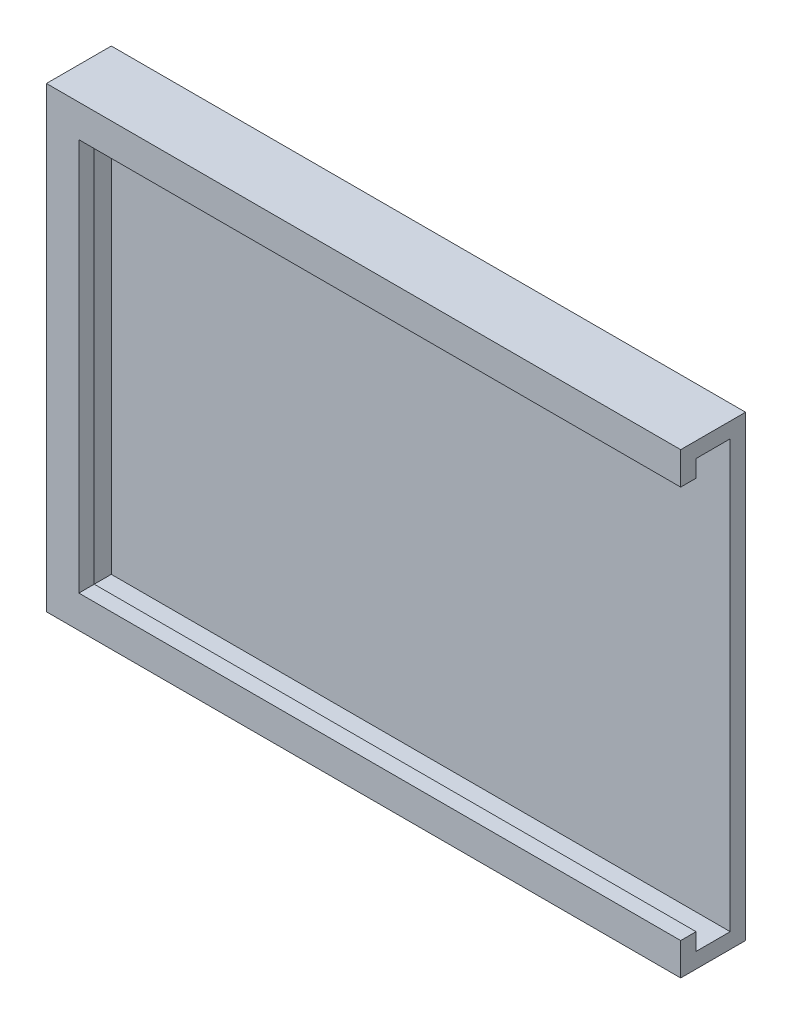
ISO-10303-21;
HEADER;
FILE_DESCRIPTION(('STEP AP214'),'2;1');
FILE_NAME('part.step','',(''),(''),'','','');
FILE_SCHEMA(('AUTOMOTIVE_DESIGN { 1 0 10303 214 1 1 1 1 }'));
ENDSEC;
DATA;
#1=APPLICATION_CONTEXT('core data for automotive mechanical design processes');
#2=APPLICATION_PROTOCOL_DEFINITION('international standard','automotive_design',2000,#1);
#3=PRODUCT_CONTEXT('',#1,'mechanical');
#4=PRODUCT('Part','Part','',(#3));
#5=PRODUCT_RELATED_PRODUCT_CATEGORY('part','',(#4));
#6=PRODUCT_DEFINITION_FORMATION('','',#4);
#7=PRODUCT_DEFINITION_CONTEXT('part definition',#1,'design');
#8=PRODUCT_DEFINITION('design','',#6,#7);
#9=PRODUCT_DEFINITION_SHAPE('','',#8);
#10=(LENGTH_UNIT() NAMED_UNIT(*) SI_UNIT(.MILLI.,.METRE.));
#11=(NAMED_UNIT(*) PLANE_ANGLE_UNIT() SI_UNIT($,.RADIAN.));
#12=(NAMED_UNIT(*) SI_UNIT($,.STERADIAN.) SOLID_ANGLE_UNIT());
#13=UNCERTAINTY_MEASURE_WITH_UNIT(LENGTH_MEASURE(1.E-05),#10,'distance_accuracy_value','');
#14=(GEOMETRIC_REPRESENTATION_CONTEXT(3) GLOBAL_UNCERTAINTY_ASSIGNED_CONTEXT((#13)) GLOBAL_UNIT_ASSIGNED_CONTEXT((#10,
#11,#12)) REPRESENTATION_CONTEXT('',''));
#15=CARTESIAN_POINT('',(0.,0.,0.));
#16=DIRECTION('',(0.,0.,1.));
#17=DIRECTION('',(1.,0.,0.));
#18=AXIS2_PLACEMENT_3D('',#15,#16,#17);
#19=CARTESIAN_POINT('',(36.25,25.,4.));
#20=DIRECTION('',(-1.,0.,0.));
#21=DIRECTION('',(0.,-1.,0.));
#22=AXIS2_PLACEMENT_3D('',#19,#20,#21);
#23=PLANE('',#22);
#24=DIRECTION('',(0.,0.,-1.));
#25=VECTOR('',#24,1.);
#26=CARTESIAN_POINT('',(36.25,23.,5.800012));
#27=LINE('',#26,#25);
#28=CARTESIAN_POINT('',(36.25,23.,5.8));
#29=VERTEX_POINT('',#28);
#30=CARTESIAN_POINT('',(36.25,23.,4.));
#31=VERTEX_POINT('',#30);
#32=EDGE_CURVE('E159',#29,#31,#27,.T.);
#33=ORIENTED_EDGE('',*,*,#32,.T.);
#34=DIRECTION('',(0.,1.,0.));
#35=VECTOR('',#34,1.);
#36=CARTESIAN_POINT('',(36.25,25.,4.));
#37=LINE('',#36,#35);
#38=CARTESIAN_POINT('',(36.25,25.,4.));
#39=VERTEX_POINT('',#38);
#40=EDGE_CURVE('E172',#31,#39,#37,.T.);
#41=ORIENTED_EDGE('',*,*,#40,.T.);
#42=DIRECTION('',(0.,0.,-1.));
#43=VECTOR('',#42,1.);
#44=CARTESIAN_POINT('',(36.25,25.,4.));
#45=LINE('',#44,#43);
#46=CARTESIAN_POINT('',(36.25,25.,0.));
#47=VERTEX_POINT('',#46);
#48=EDGE_CURVE('E205',#39,#47,#45,.T.);
#49=ORIENTED_EDGE('',*,*,#48,.T.);
#50=DIRECTION('',(0.,1.,0.));
#51=VECTOR('',#50,1.);
#52=CARTESIAN_POINT('',(36.25,25.,0.));
#53=LINE('',#52,#51);
#54=CARTESIAN_POINT('',(36.25,-25.,0.));
#55=VERTEX_POINT('',#54);
#56=EDGE_CURVE('E168',#55,#47,#53,.T.);
#57=ORIENTED_EDGE('',*,*,#56,.F.);
#58=DIRECTION('',(0.,0.,-1.));
#59=VECTOR('',#58,1.);
#60=CARTESIAN_POINT('',(36.25,-25.,4.));
#61=LINE('',#60,#59);
#62=CARTESIAN_POINT('',(36.25,-25.,4.));
#63=VERTEX_POINT('',#62);
#64=EDGE_CURVE('E181',#63,#55,#61,.T.);
#65=ORIENTED_EDGE('',*,*,#64,.F.);
#66=CARTESIAN_POINT('',(36.25,-23.,4.));
#67=VERTEX_POINT('',#66);
#68=EDGE_CURVE('E68',#63,#67,#37,.T.);
#69=ORIENTED_EDGE('',*,*,#68,.T.);
#70=DIRECTION('',(0.,0.,-1.));
#71=VECTOR('',#70,1.);
#72=CARTESIAN_POINT('',(36.25,-23.,5.800012));
#73=LINE('',#72,#71);
#74=CARTESIAN_POINT('',(36.25,-23.,5.8));
#75=VERTEX_POINT('',#74);
#76=EDGE_CURVE('E61',#75,#67,#73,.T.);
#77=ORIENTED_EDGE('',*,*,#76,.F.);
#78=DIRECTION('',(0.,1.,0.));
#79=VECTOR('',#78,1.);
#80=CARTESIAN_POINT('',(36.25,25.,5.8));
#81=LINE('',#80,#79);
#82=CARTESIAN_POINT('',(36.25,-26.8,5.8));
#83=VERTEX_POINT('',#82);
#84=EDGE_CURVE('E157',#83,#75,#81,.T.);
#85=ORIENTED_EDGE('',*,*,#84,.F.);
#86=DIRECTION('',(0.,0.,-1.));
#87=VECTOR('',#86,1.);
#88=CARTESIAN_POINT('',(36.25,-26.8,4.));
#89=LINE('',#88,#87);
#90=CARTESIAN_POINT('',(36.25,-26.8,-1.8));
#91=VERTEX_POINT('',#90);
#92=EDGE_CURVE('E230',#83,#91,#89,.T.);
#93=ORIENTED_EDGE('',*,*,#92,.T.);
#94=DIRECTION('',(0.,1.,0.));
#95=VECTOR('',#94,1.);
#96=CARTESIAN_POINT('',(36.25,25.,-1.8));
#97=LINE('',#96,#95);
#98=CARTESIAN_POINT('',(36.25,26.8,-1.8));
#99=VERTEX_POINT('',#98);
#100=EDGE_CURVE('E209',#91,#99,#97,.T.);
#101=ORIENTED_EDGE('',*,*,#100,.T.);
#102=DIRECTION('',(0.,0.,-1.));
#103=VECTOR('',#102,1.);
#104=CARTESIAN_POINT('',(36.25,26.8,4.));
#105=LINE('',#104,#103);
#106=CARTESIAN_POINT('',(36.25,26.8,5.8));
#107=VERTEX_POINT('',#106);
#108=EDGE_CURVE('E218',#107,#99,#105,.T.);
#109=ORIENTED_EDGE('',*,*,#108,.F.);
#110=EDGE_CURVE('E236',#29,#107,#81,.T.);
#111=ORIENTED_EDGE('',*,*,#110,.F.);
#112=EDGE_LOOP('',(#33,#41,#49,#57,#65,#69,#77,#85,#93,#101,#109,#111));
#113=FACE_BOUND('',#112,.T.);
#114=ADVANCED_FACE('F45',(#113),#23,.F.);
#115=CARTESIAN_POINT('',(0.,0.,5.8));
#116=DIRECTION('',(0.,0.,1.));
#117=DIRECTION('',(1.,0.,0.));
#118=AXIS2_PLACEMENT_3D('',#115,#116,#117);
#119=PLANE('',#118);
#120=DIRECTION('',(0.,1.,0.));
#121=VECTOR('',#120,1.);
#122=CARTESIAN_POINT('',(-34.25,0.,5.8));
#123=LINE('',#122,#121);
#124=CARTESIAN_POINT('',(-34.25,-23.,5.8));
#125=VERTEX_POINT('',#124);
#126=CARTESIAN_POINT('',(-34.25,23.,5.8));
#127=VERTEX_POINT('',#126);
#128=EDGE_CURVE('E136',#125,#127,#123,.T.);
#129=ORIENTED_EDGE('',*,*,#128,.T.);
#130=DIRECTION('',(1.,0.,0.));
#131=VECTOR('',#130,1.);
#132=CARTESIAN_POINT('',(0.,23.,5.8));
#133=LINE('',#132,#131);
#134=EDGE_CURVE('E147',#127,#29,#133,.T.);
#135=ORIENTED_EDGE('',*,*,#134,.T.);
#136=ORIENTED_EDGE('',*,*,#110,.T.);
#137=DIRECTION('',(-1.,0.,0.));
#138=VECTOR('',#137,1.);
#139=CARTESIAN_POINT('',(-36.25,26.8,5.8));
#140=LINE('',#139,#138);
#141=CARTESIAN_POINT('',(-38.05,26.8,5.8));
#142=VERTEX_POINT('',#141);
#143=EDGE_CURVE('E220',#107,#142,#140,.T.);
#144=ORIENTED_EDGE('',*,*,#143,.T.);
#145=DIRECTION('',(0.,-1.,0.));
#146=VECTOR('',#145,1.);
#147=CARTESIAN_POINT('',(-38.05,25.,5.8));
#148=LINE('',#147,#146);
#149=CARTESIAN_POINT('',(-38.05,-26.8,5.8));
#150=VERTEX_POINT('',#149);
#151=EDGE_CURVE('E223',#142,#150,#148,.T.);
#152=ORIENTED_EDGE('',*,*,#151,.T.);
#153=DIRECTION('',(1.,0.,0.));
#154=VECTOR('',#153,1.);
#155=CARTESIAN_POINT('',(-36.25,-26.8,5.8));
#156=LINE('',#155,#154);
#157=EDGE_CURVE('E233',#150,#83,#156,.T.);
#158=ORIENTED_EDGE('',*,*,#157,.T.);
#159=ORIENTED_EDGE('',*,*,#84,.T.);
#160=DIRECTION('',(-1.,0.,0.));
#161=VECTOR('',#160,1.);
#162=CARTESIAN_POINT('',(0.,-23.,5.8));
#163=LINE('',#162,#161);
#164=EDGE_CURVE('E148',#75,#125,#163,.T.);
#165=ORIENTED_EDGE('',*,*,#164,.T.);
#166=EDGE_LOOP('',(#129,#135,#136,#144,#152,#158,#159,#165));
#167=FACE_BOUND('',#166,.T.);
#168=ADVANCED_FACE('F155',(#167),#119,.T.);
#169=CARTESIAN_POINT('',(0.,0.,4.));
#170=DIRECTION('',(0.,0.,1.));
#171=DIRECTION('',(1.,0.,0.));
#172=AXIS2_PLACEMENT_3D('',#169,#170,#171);
#173=PLANE('',#172);
#174=DIRECTION('',(1.,0.,0.));
#175=VECTOR('',#174,1.);
#176=CARTESIAN_POINT('',(0.,23.,4.));
#177=LINE('',#176,#175);
#178=CARTESIAN_POINT('',(-34.25,23.,4.));
#179=VERTEX_POINT('',#178);
#180=EDGE_CURVE('E11',#179,#31,#177,.T.);
#181=ORIENTED_EDGE('',*,*,#180,.F.);
#182=DIRECTION('',(0.,1.,0.));
#183=VECTOR('',#182,1.);
#184=CARTESIAN_POINT('',(-34.25,0.,4.));
#185=LINE('',#184,#183);
#186=CARTESIAN_POINT('',(-34.25,-23.,4.));
#187=VERTEX_POINT('',#186);
#188=EDGE_CURVE('E54',#187,#179,#185,.T.);
#189=ORIENTED_EDGE('',*,*,#188,.F.);
#190=DIRECTION('',(-1.,0.,0.));
#191=VECTOR('',#190,1.);
#192=CARTESIAN_POINT('',(0.,-23.,4.));
#193=LINE('',#192,#191);
#194=EDGE_CURVE('E151',#67,#187,#193,.T.);
#195=ORIENTED_EDGE('',*,*,#194,.F.);
#196=ORIENTED_EDGE('',*,*,#68,.F.);
#197=DIRECTION('',(1.,0.,0.));
#198=VECTOR('',#197,1.);
#199=CARTESIAN_POINT('',(-36.25,-25.,4.));
#200=LINE('',#199,#198);
#201=CARTESIAN_POINT('',(-36.25,-25.,4.));
#202=VERTEX_POINT('',#201);
#203=EDGE_CURVE('E178',#202,#63,#200,.T.);
#204=ORIENTED_EDGE('',*,*,#203,.F.);
#205=DIRECTION('',(0.,-1.,0.));
#206=VECTOR('',#205,1.);
#207=CARTESIAN_POINT('',(-36.25,25.,4.));
#208=LINE('',#207,#206);
#209=CARTESIAN_POINT('',(-36.25,25.,4.));
#210=VERTEX_POINT('',#209);
#211=EDGE_CURVE('E175',#210,#202,#208,.T.);
#212=ORIENTED_EDGE('',*,*,#211,.F.);
#213=DIRECTION('',(-1.,0.,0.));
#214=VECTOR('',#213,1.);
#215=CARTESIAN_POINT('',(-36.25,25.,4.));
#216=LINE('',#215,#214);
#217=EDGE_CURVE('E171',#39,#210,#216,.T.);
#218=ORIENTED_EDGE('',*,*,#217,.F.);
#219=ORIENTED_EDGE('',*,*,#40,.F.);
#220=EDGE_LOOP('',(#181,#189,#195,#196,#204,#212,#218,#219));
#221=FACE_BOUND('',#220,.T.);
#222=ADVANCED_FACE('F257',(#221),#173,.F.);
#223=CARTESIAN_POINT('',(-36.25,26.8,4.));
#224=DIRECTION('',(0.,-1.,0.));
#225=DIRECTION('',(0.,0.,-1.));
#226=AXIS2_PLACEMENT_3D('',#223,#224,#225);
#227=PLANE('',#226);
#228=DIRECTION('',(-1.,0.,0.));
#229=VECTOR('',#228,1.);
#230=CARTESIAN_POINT('',(-36.25,26.8,-1.8));
#231=LINE('',#230,#229);
#232=CARTESIAN_POINT('',(-38.05,26.8,-1.8));
#233=VERTEX_POINT('',#232);
#234=EDGE_CURVE('E210',#99,#233,#231,.T.);
#235=ORIENTED_EDGE('',*,*,#234,.T.);
#236=DIRECTION('',(0.,0.,-1.));
#237=VECTOR('',#236,1.);
#238=CARTESIAN_POINT('',(-38.05,26.8,4.));
#239=LINE('',#238,#237);
#240=EDGE_CURVE('E214',#142,#233,#239,.T.);
#241=ORIENTED_EDGE('',*,*,#240,.F.);
#242=ORIENTED_EDGE('',*,*,#143,.F.);
#243=ORIENTED_EDGE('',*,*,#108,.T.);
#244=EDGE_LOOP('',(#235,#241,#242,#243));
#245=FACE_BOUND('',#244,.T.);
#246=ADVANCED_FACE('F269',(#245),#227,.F.);
#247=CARTESIAN_POINT('',(-38.05,25.,4.));
#248=DIRECTION('',(1.,0.,0.));
#249=DIRECTION('',(0.,1.,0.));
#250=AXIS2_PLACEMENT_3D('',#247,#248,#249);
#251=PLANE('',#250);
#252=DIRECTION('',(0.,-1.,0.));
#253=VECTOR('',#252,1.);
#254=CARTESIAN_POINT('',(-38.05,25.,-1.8));
#255=LINE('',#254,#253);
#256=CARTESIAN_POINT('',(-38.05,-26.8,-1.8));
#257=VERTEX_POINT('',#256);
#258=EDGE_CURVE('E213',#233,#257,#255,.T.);
#259=ORIENTED_EDGE('',*,*,#258,.T.);
#260=DIRECTION('',(0.,0.,-1.));
#261=VECTOR('',#260,1.);
#262=CARTESIAN_POINT('',(-38.05,-26.8,4.));
#263=LINE('',#262,#261);
#264=EDGE_CURVE('E219',#150,#257,#263,.T.);
#265=ORIENTED_EDGE('',*,*,#264,.F.);
#266=ORIENTED_EDGE('',*,*,#151,.F.);
#267=ORIENTED_EDGE('',*,*,#240,.T.);
#268=EDGE_LOOP('',(#259,#265,#266,#267));
#269=FACE_BOUND('',#268,.T.);
#270=ADVANCED_FACE('F277',(#269),#251,.F.);
#271=CARTESIAN_POINT('',(-36.25,-26.8,4.));
#272=DIRECTION('',(0.,1.,0.));
#273=DIRECTION('',(0.,0.,1.));
#274=AXIS2_PLACEMENT_3D('',#271,#272,#273);
#275=PLANE('',#274);
#276=DIRECTION('',(1.,0.,0.));
#277=VECTOR('',#276,1.);
#278=CARTESIAN_POINT('',(-36.25,-26.8,-1.8));
#279=LINE('',#278,#277);
#280=EDGE_CURVE('E226',#257,#91,#279,.T.);
#281=ORIENTED_EDGE('',*,*,#280,.T.);
#282=ORIENTED_EDGE('',*,*,#92,.F.);
#283=ORIENTED_EDGE('',*,*,#157,.F.);
#284=ORIENTED_EDGE('',*,*,#264,.T.);
#285=EDGE_LOOP('',(#281,#282,#283,#284));
#286=FACE_BOUND('',#285,.T.);
#287=ADVANCED_FACE('F281',(#286),#275,.F.);
#288=CARTESIAN_POINT('',(0.,0.,-1.8));
#289=DIRECTION('',(0.,0.,1.));
#290=DIRECTION('',(1.,0.,0.));
#291=AXIS2_PLACEMENT_3D('',#288,#289,#290);
#292=PLANE('',#291);
#293=ORIENTED_EDGE('',*,*,#100,.F.);
#294=ORIENTED_EDGE('',*,*,#280,.F.);
#295=ORIENTED_EDGE('',*,*,#258,.F.);
#296=ORIENTED_EDGE('',*,*,#234,.F.);
#297=EDGE_LOOP('',(#293,#294,#295,#296));
#298=FACE_BOUND('',#297,.T.);
#299=ADVANCED_FACE('F47',(#298),#292,.F.);
#300=CARTESIAN_POINT('',(-36.25,25.,4.));
#301=DIRECTION('',(0.,-1.,0.));
#302=DIRECTION('',(0.,0.,-1.));
#303=AXIS2_PLACEMENT_3D('',#300,#301,#302);
#304=PLANE('',#303);
#305=DIRECTION('',(-1.,0.,0.));
#306=VECTOR('',#305,1.);
#307=CARTESIAN_POINT('',(-36.25,25.,0.));
#308=LINE('',#307,#306);
#309=CARTESIAN_POINT('',(-36.25,25.,0.));
#310=VERTEX_POINT('',#309);
#311=EDGE_CURVE('E185',#47,#310,#308,.T.);
#312=ORIENTED_EDGE('',*,*,#311,.F.);
#313=ORIENTED_EDGE('',*,*,#48,.F.);
#314=ORIENTED_EDGE('',*,*,#217,.T.);
#315=DIRECTION('',(0.,0.,-1.));
#316=VECTOR('',#315,1.);
#317=CARTESIAN_POINT('',(-36.25,25.,4.));
#318=LINE('',#317,#316);
#319=EDGE_CURVE('E201',#210,#310,#318,.T.);
#320=ORIENTED_EDGE('',*,*,#319,.T.);
#321=EDGE_LOOP('',(#312,#313,#314,#320));
#322=FACE_BOUND('',#321,.T.);
#323=ADVANCED_FACE('F295',(#322),#304,.T.);
#324=CARTESIAN_POINT('',(-36.25,25.,4.));
#325=DIRECTION('',(1.,0.,0.));
#326=DIRECTION('',(0.,1.,0.));
#327=AXIS2_PLACEMENT_3D('',#324,#325,#326);
#328=PLANE('',#327);
#329=DIRECTION('',(0.,-1.,0.));
#330=VECTOR('',#329,1.);
#331=CARTESIAN_POINT('',(-36.25,25.,0.));
#332=LINE('',#331,#330);
#333=CARTESIAN_POINT('',(-36.25,-25.,0.));
#334=VERTEX_POINT('',#333);
#335=EDGE_CURVE('E188',#310,#334,#332,.T.);
#336=ORIENTED_EDGE('',*,*,#335,.F.);
#337=ORIENTED_EDGE('',*,*,#319,.F.);
#338=ORIENTED_EDGE('',*,*,#211,.T.);
#339=DIRECTION('',(0.,0.,-1.));
#340=VECTOR('',#339,1.);
#341=CARTESIAN_POINT('',(-36.25,-25.,4.));
#342=LINE('',#341,#340);
#343=EDGE_CURVE('E197',#202,#334,#342,.T.);
#344=ORIENTED_EDGE('',*,*,#343,.T.);
#345=EDGE_LOOP('',(#336,#337,#338,#344));
#346=FACE_BOUND('',#345,.T.);
#347=ADVANCED_FACE('F293',(#346),#328,.T.);
#348=CARTESIAN_POINT('',(-36.25,-25.,4.));
#349=DIRECTION('',(0.,1.,0.));
#350=DIRECTION('',(0.,0.,1.));
#351=AXIS2_PLACEMENT_3D('',#348,#349,#350);
#352=PLANE('',#351);
#353=DIRECTION('',(1.,0.,0.));
#354=VECTOR('',#353,1.);
#355=CARTESIAN_POINT('',(-36.25,-25.,0.));
#356=LINE('',#355,#354);
#357=EDGE_CURVE('E191',#334,#55,#356,.T.);
#358=ORIENTED_EDGE('',*,*,#357,.F.);
#359=ORIENTED_EDGE('',*,*,#343,.F.);
#360=ORIENTED_EDGE('',*,*,#203,.T.);
#361=ORIENTED_EDGE('',*,*,#64,.T.);
#362=EDGE_LOOP('',(#358,#359,#360,#361));
#363=FACE_BOUND('',#362,.T.);
#364=ADVANCED_FACE('F288',(#363),#352,.T.);
#365=CARTESIAN_POINT('',(0.,0.,0.));
#366=DIRECTION('',(0.,0.,1.));
#367=DIRECTION('',(1.,0.,0.));
#368=AXIS2_PLACEMENT_3D('',#365,#366,#367);
#369=PLANE('',#368);
#370=ORIENTED_EDGE('',*,*,#56,.T.);
#371=ORIENTED_EDGE('',*,*,#311,.T.);
#372=ORIENTED_EDGE('',*,*,#335,.T.);
#373=ORIENTED_EDGE('',*,*,#357,.T.);
#374=EDGE_LOOP('',(#370,#371,#372,#373));
#375=FACE_BOUND('',#374,.T.);
#376=ADVANCED_FACE('F297',(#375),#369,.T.);
#377=CARTESIAN_POINT('',(34.25,23.,5.800012));
#378=DIRECTION('',(0.,-1.,0.));
#379=DIRECTION('',(0.,0.,-1.));
#380=AXIS2_PLACEMENT_3D('',#377,#378,#379);
#381=PLANE('',#380);
#382=DIRECTION('',(0.,0.,-1.));
#383=VECTOR('',#382,1.);
#384=CARTESIAN_POINT('',(-34.25,23.,5.800012));
#385=LINE('',#384,#383);
#386=EDGE_CURVE('E142',#127,#179,#385,.T.);
#387=ORIENTED_EDGE('',*,*,#386,.T.);
#388=ORIENTED_EDGE('',*,*,#180,.T.);
#389=ORIENTED_EDGE('',*,*,#32,.F.);
#390=ORIENTED_EDGE('',*,*,#134,.F.);
#391=EDGE_LOOP('',(#387,#388,#389,#390));
#392=FACE_BOUND('',#391,.T.);
#393=ADVANCED_FACE('F254',(#392),#381,.T.);
#394=CARTESIAN_POINT('',(-34.25,23.,5.800012));
#395=DIRECTION('',(1.,0.,0.));
#396=DIRECTION('',(0.,1.,0.));
#397=AXIS2_PLACEMENT_3D('',#394,#395,#396);
#398=PLANE('',#397);
#399=DIRECTION('',(0.,0.,-1.));
#400=VECTOR('',#399,1.);
#401=CARTESIAN_POINT('',(-34.25,-23.,5.800012));
#402=LINE('',#401,#400);
#403=EDGE_CURVE('E139',#125,#187,#402,.T.);
#404=ORIENTED_EDGE('',*,*,#403,.T.);
#405=ORIENTED_EDGE('',*,*,#188,.T.);
#406=ORIENTED_EDGE('',*,*,#386,.F.);
#407=ORIENTED_EDGE('',*,*,#128,.F.);
#408=EDGE_LOOP('',(#404,#405,#406,#407));
#409=FACE_BOUND('',#408,.T.);
#410=ADVANCED_FACE('F138',(#409),#398,.T.);
#411=CARTESIAN_POINT('',(36.25,-23.,5.800012));
#412=DIRECTION('',(0.,1.,0.));
#413=DIRECTION('',(0.,0.,1.));
#414=AXIS2_PLACEMENT_3D('',#411,#412,#413);
#415=PLANE('',#414);
#416=ORIENTED_EDGE('',*,*,#76,.T.);
#417=ORIENTED_EDGE('',*,*,#194,.T.);
#418=ORIENTED_EDGE('',*,*,#403,.F.);
#419=ORIENTED_EDGE('',*,*,#164,.F.);
#420=EDGE_LOOP('',(#416,#417,#418,#419));
#421=FACE_BOUND('',#420,.T.);
#422=ADVANCED_FACE('F150',(#421),#415,.T.);
#423=CLOSED_SHELL('',(#114,#168,#222,#246,#270,#287,#299,#323,#347,#364,#376,#393,#410,#422));
#424=MANIFOLD_SOLID_BREP('B2',#423);
#425=ADVANCED_BREP_SHAPE_REPRESENTATION('',(#18,#424),#14);
#426=SHAPE_DEFINITION_REPRESENTATION(#9,#425);
ENDSEC;
END-ISO-10303-21;
